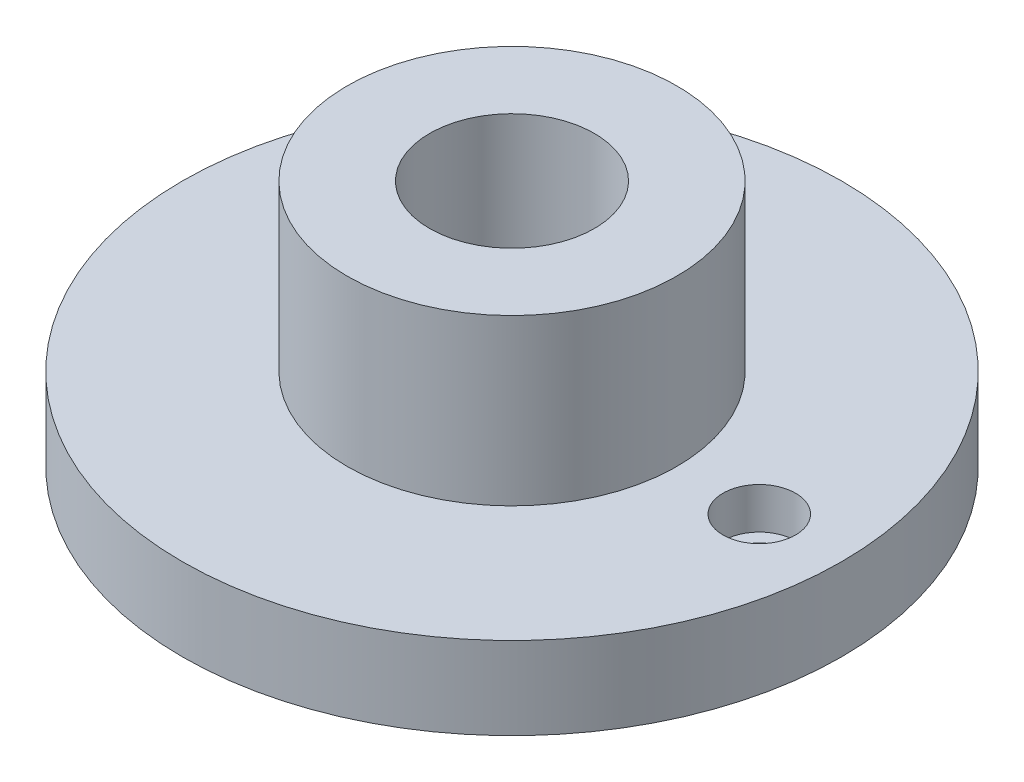
ISO-10303-21;
HEADER;
FILE_DESCRIPTION(('STEP AP214'),'2;1');
FILE_NAME('part.step','',(''),(''),'','','');
FILE_SCHEMA(('AUTOMOTIVE_DESIGN { 1 0 10303 214 1 1 1 1 }'));
ENDSEC;
DATA;
#1=APPLICATION_CONTEXT('core data for automotive mechanical design processes');
#2=APPLICATION_PROTOCOL_DEFINITION('international standard','automotive_design',2000,#1);
#3=PRODUCT_CONTEXT('',#1,'mechanical');
#4=PRODUCT('Part','Part','',(#3));
#5=PRODUCT_RELATED_PRODUCT_CATEGORY('part','',(#4));
#6=PRODUCT_DEFINITION_FORMATION('','',#4);
#7=PRODUCT_DEFINITION_CONTEXT('part definition',#1,'design');
#8=PRODUCT_DEFINITION('design','',#6,#7);
#9=PRODUCT_DEFINITION_SHAPE('','',#8);
#10=(LENGTH_UNIT() NAMED_UNIT(*) SI_UNIT(.MILLI.,.METRE.));
#11=(NAMED_UNIT(*) PLANE_ANGLE_UNIT() SI_UNIT($,.RADIAN.));
#12=(NAMED_UNIT(*) SI_UNIT($,.STERADIAN.) SOLID_ANGLE_UNIT());
#13=UNCERTAINTY_MEASURE_WITH_UNIT(LENGTH_MEASURE(1.E-05),#10,'distance_accuracy_value','');
#14=(GEOMETRIC_REPRESENTATION_CONTEXT(3) GLOBAL_UNCERTAINTY_ASSIGNED_CONTEXT((#13)) GLOBAL_UNIT_ASSIGNED_CONTEXT((#10,
#11,#12)) REPRESENTATION_CONTEXT('',''));
#15=CARTESIAN_POINT('',(0.,0.,0.));
#16=DIRECTION('',(0.,0.,1.));
#17=DIRECTION('',(1.,0.,0.));
#18=AXIS2_PLACEMENT_3D('',#15,#16,#17);
#19=CARTESIAN_POINT('',(0.,12.7,0.));
#20=DIRECTION('',(0.,-1.,0.));
#21=DIRECTION('',(0.,0.,-1.));
#22=AXIS2_PLACEMENT_3D('',#19,#20,#21);
#23=CYLINDRICAL_SURFACE('',#22,50.8);
#24=CARTESIAN_POINT('',(0.,12.7,0.));
#25=DIRECTION('',(0.,1.,0.));
#26=DIRECTION('',(0.,0.,1.));
#27=AXIS2_PLACEMENT_3D('',#24,#25,#26);
#28=CIRCLE('',#27,50.8);
#29=CARTESIAN_POINT('',(0.,12.7,50.8));
#30=VERTEX_POINT('',#29);
#31=EDGE_CURVE('E46',#30,#30,#28,.T.);
#32=ORIENTED_EDGE('',*,*,#31,.F.);
#33=EDGE_LOOP('',(#32));
#34=FACE_BOUND('',#33,.T.);
#35=CARTESIAN_POINT('',(0.,0.,0.));
#36=DIRECTION('',(0.,1.,0.));
#37=DIRECTION('',(0.,0.,1.));
#38=AXIS2_PLACEMENT_3D('',#35,#36,#37);
#39=CIRCLE('',#38,50.8);
#40=CARTESIAN_POINT('',(0.,0.,50.8));
#41=VERTEX_POINT('',#40);
#42=EDGE_CURVE('E45',#41,#41,#39,.T.);
#43=ORIENTED_EDGE('',*,*,#42,.T.);
#44=EDGE_LOOP('',(#43));
#45=FACE_BOUND('',#44,.T.);
#46=ADVANCED_FACE('F39',(#34,#45),#23,.T.);
#47=CARTESIAN_POINT('',(0.,12.7,0.));
#48=DIRECTION('',(0.,1.,0.));
#49=DIRECTION('',(0.,0.,1.));
#50=AXIS2_PLACEMENT_3D('',#47,#48,#49);
#51=PLANE('',#50);
#52=CARTESIAN_POINT('',(38.1,12.7,0.));
#53=DIRECTION('',(0.,1.,0.));
#54=DIRECTION('',(0.,0.,1.));
#55=AXIS2_PLACEMENT_3D('',#52,#53,#54);
#56=CIRCLE('',#55,5.588);
#57=CARTESIAN_POINT('',(38.1,12.7,5.588));
#58=VERTEX_POINT('',#57);
#59=EDGE_CURVE('E67',#58,#58,#56,.T.);
#60=ORIENTED_EDGE('',*,*,#59,.F.);
#61=EDGE_LOOP('',(#60));
#62=FACE_BOUND('',#61,.T.);
#63=CARTESIAN_POINT('',(0.,12.7,0.));
#64=DIRECTION('',(0.,1.,0.));
#65=DIRECTION('',(0.,0.,1.));
#66=AXIS2_PLACEMENT_3D('',#63,#64,#65);
#67=CIRCLE('',#66,25.4);
#68=CARTESIAN_POINT('',(0.,12.7,25.4));
#69=VERTEX_POINT('',#68);
#70=EDGE_CURVE('E10',#69,#69,#67,.T.);
#71=ORIENTED_EDGE('',*,*,#70,.F.);
#72=EDGE_LOOP('',(#71));
#73=FACE_BOUND('',#72,.T.);
#74=ORIENTED_EDGE('',*,*,#31,.T.);
#75=EDGE_LOOP('',(#74));
#76=FACE_BOUND('',#75,.T.);
#77=ADVANCED_FACE('F79',(#62,#73,#76),#51,.T.);
#78=CARTESIAN_POINT('',(0.,0.,0.));
#79=DIRECTION('',(0.,1.,0.));
#80=DIRECTION('',(0.,0.,1.));
#81=AXIS2_PLACEMENT_3D('',#78,#79,#80);
#82=PLANE('',#81);
#83=CARTESIAN_POINT('',(38.1,0.,0.));
#84=DIRECTION('',(0.,1.,0.));
#85=DIRECTION('',(0.,0.,1.));
#86=AXIS2_PLACEMENT_3D('',#83,#84,#85);
#87=CIRCLE('',#86,3.556);
#88=CARTESIAN_POINT('',(38.1,0.,3.556));
#89=VERTEX_POINT('',#88);
#90=EDGE_CURVE('E56',#89,#89,#87,.T.);
#91=ORIENTED_EDGE('',*,*,#90,.T.);
#92=EDGE_LOOP('',(#91));
#93=FACE_BOUND('',#92,.T.);
#94=CARTESIAN_POINT('',(0.,0.,0.));
#95=DIRECTION('',(0.,1.,0.));
#96=DIRECTION('',(0.,0.,1.));
#97=AXIS2_PLACEMENT_3D('',#94,#95,#96);
#98=CIRCLE('',#97,12.7);
#99=CARTESIAN_POINT('',(0.,0.,12.7));
#100=VERTEX_POINT('',#99);
#101=EDGE_CURVE('E54',#100,#100,#98,.T.);
#102=ORIENTED_EDGE('',*,*,#101,.T.);
#103=EDGE_LOOP('',(#102));
#104=FACE_BOUND('',#103,.T.);
#105=ORIENTED_EDGE('',*,*,#42,.F.);
#106=EDGE_LOOP('',(#105));
#107=FACE_BOUND('',#106,.T.);
#108=ADVANCED_FACE('F78',(#93,#104,#107),#82,.F.);
#109=CARTESIAN_POINT('',(0.,38.1,0.));
#110=DIRECTION('',(0.,-1.,0.));
#111=DIRECTION('',(0.,0.,-1.));
#112=AXIS2_PLACEMENT_3D('',#109,#110,#111);
#113=CYLINDRICAL_SURFACE('',#112,25.4);
#114=CARTESIAN_POINT('',(0.,38.1,0.));
#115=DIRECTION('',(0.,1.,0.));
#116=DIRECTION('',(0.,0.,1.));
#117=AXIS2_PLACEMENT_3D('',#114,#115,#116);
#118=CIRCLE('',#117,25.4);
#119=CARTESIAN_POINT('',(0.,38.1,25.4));
#120=VERTEX_POINT('',#119);
#121=EDGE_CURVE('E55',#120,#120,#118,.T.);
#122=ORIENTED_EDGE('',*,*,#121,.F.);
#123=EDGE_LOOP('',(#122));
#124=FACE_BOUND('',#123,.T.);
#125=ORIENTED_EDGE('',*,*,#70,.T.);
#126=EDGE_LOOP('',(#125));
#127=FACE_BOUND('',#126,.T.);
#128=ADVANCED_FACE('F89',(#124,#127),#113,.T.);
#129=CARTESIAN_POINT('',(0.,38.1,0.));
#130=DIRECTION('',(0.,1.,0.));
#131=DIRECTION('',(0.,0.,1.));
#132=AXIS2_PLACEMENT_3D('',#129,#130,#131);
#133=PLANE('',#132);
#134=CARTESIAN_POINT('',(0.,38.1,0.));
#135=DIRECTION('',(0.,1.,0.));
#136=DIRECTION('',(0.,0.,1.));
#137=AXIS2_PLACEMENT_3D('',#134,#135,#136);
#138=CIRCLE('',#137,12.7);
#139=CARTESIAN_POINT('',(0.,38.1,12.7));
#140=VERTEX_POINT('',#139);
#141=EDGE_CURVE('E57',#140,#140,#138,.T.);
#142=ORIENTED_EDGE('',*,*,#141,.F.);
#143=EDGE_LOOP('',(#142));
#144=FACE_BOUND('',#143,.T.);
#145=ORIENTED_EDGE('',*,*,#121,.T.);
#146=EDGE_LOOP('',(#145));
#147=FACE_BOUND('',#146,.T.);
#148=ADVANCED_FACE('F96',(#144,#147),#133,.T.);
#149=CARTESIAN_POINT('',(0.,0.,0.));
#150=DIRECTION('',(0.,1.,0.));
#151=DIRECTION('',(0.,0.,1.));
#152=AXIS2_PLACEMENT_3D('',#149,#150,#151);
#153=CYLINDRICAL_SURFACE('',#152,12.7);
#154=ORIENTED_EDGE('',*,*,#101,.F.);
#155=EDGE_LOOP('',(#154));
#156=FACE_BOUND('',#155,.T.);
#157=ORIENTED_EDGE('',*,*,#141,.T.);
#158=EDGE_LOOP('',(#157));
#159=FACE_BOUND('',#158,.T.);
#160=ADVANCED_FACE('F103',(#156,#159),#153,.F.);
#161=CARTESIAN_POINT('',(38.1,12.7,0.));
#162=DIRECTION('',(0.,1.,0.));
#163=DIRECTION('',(0.,0.,1.));
#164=AXIS2_PLACEMENT_3D('',#161,#162,#163);
#165=CYLINDRICAL_SURFACE('',#164,3.556);
#166=ORIENTED_EDGE('',*,*,#90,.F.);
#167=EDGE_LOOP('',(#166));
#168=FACE_BOUND('',#167,.T.);
#169=CARTESIAN_POINT('',(38.1,6.35,0.));
#170=DIRECTION('',(0.,1.,0.));
#171=DIRECTION('',(0.,0.,1.));
#172=AXIS2_PLACEMENT_3D('',#169,#170,#171);
#173=CIRCLE('',#172,3.55600000000001);
#174=CARTESIAN_POINT('',(38.1,6.35,3.55600000000001));
#175=VERTEX_POINT('',#174);
#176=EDGE_CURVE('E63',#175,#175,#173,.T.);
#177=ORIENTED_EDGE('',*,*,#176,.T.);
#178=EDGE_LOOP('',(#177));
#179=FACE_BOUND('',#178,.T.);
#180=ADVANCED_FACE('F110',(#168,#179),#165,.F.);
#181=CARTESIAN_POINT('',(41.656,6.35,0.));
#182=DIRECTION('',(0.,-1.,0.));
#183=DIRECTION('',(0.,0.,-1.));
#184=AXIS2_PLACEMENT_3D('',#181,#182,#183);
#185=PLANE('',#184);
#186=ORIENTED_EDGE('',*,*,#176,.F.);
#187=EDGE_LOOP('',(#186));
#188=FACE_BOUND('',#187,.T.);
#189=CARTESIAN_POINT('',(38.1,6.35,0.));
#190=DIRECTION('',(0.,1.,0.));
#191=DIRECTION('',(0.,0.,1.));
#192=AXIS2_PLACEMENT_3D('',#189,#190,#191);
#193=CIRCLE('',#192,5.588);
#194=CARTESIAN_POINT('',(38.1,6.35,5.588));
#195=VERTEX_POINT('',#194);
#196=EDGE_CURVE('E70',#195,#195,#193,.T.);
#197=ORIENTED_EDGE('',*,*,#196,.T.);
#198=EDGE_LOOP('',(#197));
#199=FACE_BOUND('',#198,.T.);
#200=ADVANCED_FACE('F109',(#188,#199),#185,.F.);
#201=CARTESIAN_POINT('',(38.1,12.7,0.));
#202=DIRECTION('',(0.,1.,0.));
#203=DIRECTION('',(0.,0.,1.));
#204=AXIS2_PLACEMENT_3D('',#201,#202,#203);
#205=CYLINDRICAL_SURFACE('',#204,5.588);
#206=ORIENTED_EDGE('',*,*,#196,.F.);
#207=EDGE_LOOP('',(#206));
#208=FACE_BOUND('',#207,.T.);
#209=ORIENTED_EDGE('',*,*,#59,.T.);
#210=EDGE_LOOP('',(#209));
#211=FACE_BOUND('',#210,.T.);
#212=ADVANCED_FACE('F74',(#208,#211),#205,.F.);
#213=CLOSED_SHELL('',(#46,#77,#108,#128,#148,#160,#180,#200,#212));
#214=MANIFOLD_SOLID_BREP('B2',#213);
#215=ADVANCED_BREP_SHAPE_REPRESENTATION('',(#18,#214),#14);
#216=SHAPE_DEFINITION_REPRESENTATION(#9,#215);
ENDSEC;
END-ISO-10303-21;
